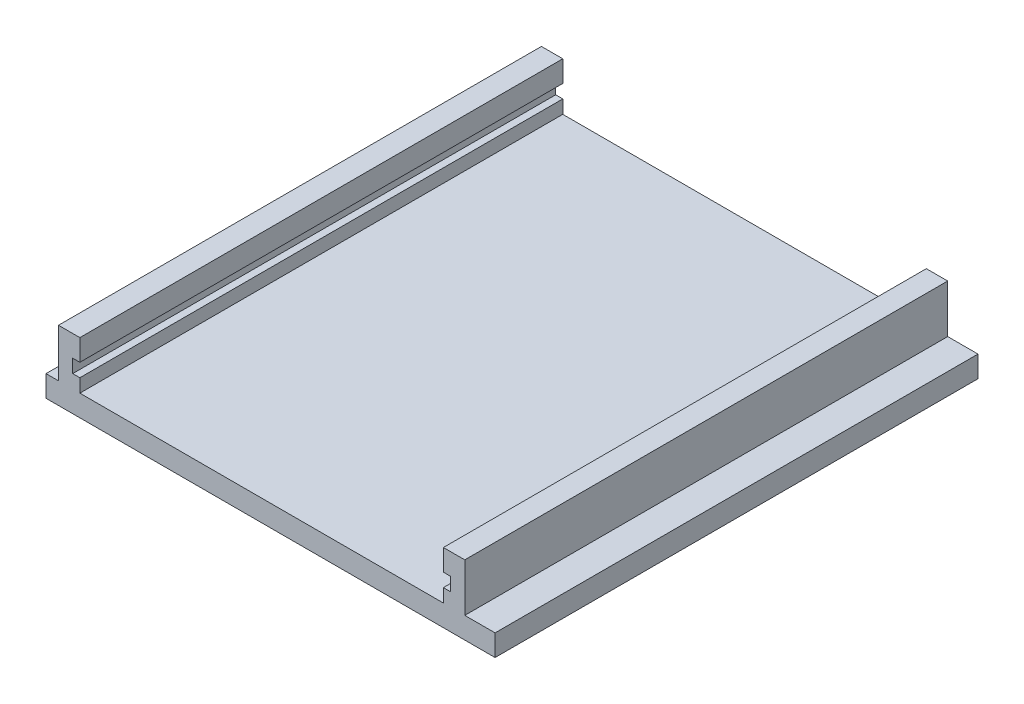
ISO-10303-21;
HEADER;
FILE_DESCRIPTION(('STEP AP214'),'2;1');
FILE_NAME('part.step','',(''),(''),'','','');
FILE_SCHEMA(('AUTOMOTIVE_DESIGN { 1 0 10303 214 1 1 1 1 }'));
ENDSEC;
DATA;
#1=APPLICATION_CONTEXT('core data for automotive mechanical design processes');
#2=APPLICATION_PROTOCOL_DEFINITION('international standard','automotive_design',2000,#1);
#3=PRODUCT_CONTEXT('',#1,'mechanical');
#4=PRODUCT('Part','Part','',(#3));
#5=PRODUCT_RELATED_PRODUCT_CATEGORY('part','',(#4));
#6=PRODUCT_DEFINITION_FORMATION('','',#4);
#7=PRODUCT_DEFINITION_CONTEXT('part definition',#1,'design');
#8=PRODUCT_DEFINITION('design','',#6,#7);
#9=PRODUCT_DEFINITION_SHAPE('','',#8);
#10=(LENGTH_UNIT() NAMED_UNIT(*) SI_UNIT(.MILLI.,.METRE.));
#11=(NAMED_UNIT(*) PLANE_ANGLE_UNIT() SI_UNIT($,.RADIAN.));
#12=(NAMED_UNIT(*) SI_UNIT($,.STERADIAN.) SOLID_ANGLE_UNIT());
#13=UNCERTAINTY_MEASURE_WITH_UNIT(LENGTH_MEASURE(1.E-05),#10,'distance_accuracy_value','');
#14=(GEOMETRIC_REPRESENTATION_CONTEXT(3) GLOBAL_UNCERTAINTY_ASSIGNED_CONTEXT((#13)) GLOBAL_UNIT_ASSIGNED_CONTEXT((#10,
#11,#12)) REPRESENTATION_CONTEXT('',''));
#15=CARTESIAN_POINT('',(0.,0.,0.));
#16=DIRECTION('',(0.,0.,1.));
#17=DIRECTION('',(1.,0.,0.));
#18=AXIS2_PLACEMENT_3D('',#15,#16,#17);
#19=CARTESIAN_POINT('',(4.826,9.906,0.));
#20=DIRECTION('',(-1.,0.,0.));
#21=DIRECTION('',(0.,0.,1.));
#22=AXIS2_PLACEMENT_3D('',#19,#20,#21);
#23=PLANE('',#22);
#24=DIRECTION('',(0.,-1.,0.));
#25=VECTOR('',#24,1.);
#26=CARTESIAN_POINT('',(4.826,9.906,-68.834));
#27=LINE('',#26,#25);
#28=CARTESIAN_POINT('',(4.826,4.953,-68.834));
#29=VERTEX_POINT('',#28);
#30=CARTESIAN_POINT('',(4.826,3.048,-68.834));
#31=VERTEX_POINT('',#30);
#32=EDGE_CURVE('E230',#29,#31,#27,.T.);
#33=ORIENTED_EDGE('',*,*,#32,.F.);
#34=DIRECTION('',(0.,0.,1.));
#35=VECTOR('',#34,1.);
#36=CARTESIAN_POINT('',(4.826,4.953,-68.834));
#37=LINE('',#36,#35);
#38=CARTESIAN_POINT('',(4.826,4.953,0.));
#39=VERTEX_POINT('',#38);
#40=EDGE_CURVE('E203',#29,#39,#37,.T.);
#41=ORIENTED_EDGE('',*,*,#40,.T.);
#42=DIRECTION('',(0.,-1.,0.));
#43=VECTOR('',#42,1.);
#44=CARTESIAN_POINT('',(4.826,9.906,0.));
#45=LINE('',#44,#43);
#46=CARTESIAN_POINT('',(4.826,3.048,0.));
#47=VERTEX_POINT('',#46);
#48=EDGE_CURVE('E58',#39,#47,#45,.T.);
#49=ORIENTED_EDGE('',*,*,#48,.T.);
#50=DIRECTION('',(0.,0.,-1.));
#51=VECTOR('',#50,1.);
#52=CARTESIAN_POINT('',(4.826,3.048,0.));
#53=LINE('',#52,#51);
#54=EDGE_CURVE('E205',#47,#31,#53,.T.);
#55=ORIENTED_EDGE('',*,*,#54,.T.);
#56=EDGE_LOOP('',(#33,#41,#49,#55));
#57=FACE_BOUND('',#56,.T.);
#58=ADVANCED_FACE('F35',(#57),#23,.F.);
#59=CARTESIAN_POINT('',(0.,3.048,0.));
#60=DIRECTION('',(0.,-1.,0.));
#61=DIRECTION('',(0.,0.,-1.));
#62=AXIS2_PLACEMENT_3D('',#59,#60,#61);
#63=PLANE('',#62);
#64=ORIENTED_EDGE('',*,*,#54,.F.);
#65=DIRECTION('',(1.,0.,0.));
#66=VECTOR('',#65,1.);
#67=CARTESIAN_POINT('',(0.,3.048,0.));
#68=LINE('',#67,#66);
#69=CARTESIAN_POINT('',(56.642,3.048,0.));
#70=VERTEX_POINT('',#69);
#71=EDGE_CURVE('E296',#47,#70,#68,.T.);
#72=ORIENTED_EDGE('',*,*,#71,.T.);
#73=DIRECTION('',(0.,0.,1.));
#74=VECTOR('',#73,1.);
#75=CARTESIAN_POINT('',(56.642,3.048,-68.834));
#76=LINE('',#75,#74);
#77=CARTESIAN_POINT('',(56.642,3.048,-68.834));
#78=VERTEX_POINT('',#77);
#79=EDGE_CURVE('E263',#78,#70,#76,.T.);
#80=ORIENTED_EDGE('',*,*,#79,.F.);
#81=DIRECTION('',(-1.,0.,0.));
#82=VECTOR('',#81,1.);
#83=CARTESIAN_POINT('',(0.,3.048,-68.834));
#84=LINE('',#83,#82);
#85=EDGE_CURVE('E302',#78,#31,#84,.T.);
#86=ORIENTED_EDGE('',*,*,#85,.T.);
#87=EDGE_LOOP('',(#64,#72,#80,#86));
#88=FACE_BOUND('',#87,.T.);
#89=ADVANCED_FACE('F340',(#88),#63,.F.);
#90=DIRECTION('',(0.,0.,1.));
#91=VECTOR('',#90,1.);
#92=CARTESIAN_POINT('',(1.778,3.048,0.));
#93=LINE('',#92,#91);
#94=CARTESIAN_POINT('',(1.778,3.048,-68.834));
#95=VERTEX_POINT('',#94);
#96=CARTESIAN_POINT('',(1.778,3.048,0.));
#97=VERTEX_POINT('',#96);
#98=EDGE_CURVE('E212',#95,#97,#93,.T.);
#99=ORIENTED_EDGE('',*,*,#98,.F.);
#100=CARTESIAN_POINT('',(0.,3.048,-68.834));
#101=VERTEX_POINT('',#100);
#102=EDGE_CURVE('E298',#95,#101,#84,.T.);
#103=ORIENTED_EDGE('',*,*,#102,.T.);
#104=DIRECTION('',(0.,0.,1.));
#105=VECTOR('',#104,1.);
#106=CARTESIAN_POINT('',(0.,3.048,0.));
#107=LINE('',#106,#105);
#108=CARTESIAN_POINT('',(0.,3.048,0.));
#109=VERTEX_POINT('',#108);
#110=EDGE_CURVE('E288',#101,#109,#107,.T.);
#111=ORIENTED_EDGE('',*,*,#110,.T.);
#112=EDGE_CURVE('E293',#109,#97,#68,.T.);
#113=ORIENTED_EDGE('',*,*,#112,.T.);
#114=EDGE_LOOP('',(#99,#103,#111,#113));
#115=FACE_BOUND('',#114,.T.);
#116=ADVANCED_FACE('F334',(#115),#63,.F.);
#117=CARTESIAN_POINT('',(56.642,9.906,-68.834));
#118=DIRECTION('',(1.,0.,0.));
#119=DIRECTION('',(0.,0.,-1.));
#120=AXIS2_PLACEMENT_3D('',#117,#118,#119);
#121=PLANE('',#120);
#122=DIRECTION('',(0.,-1.,0.));
#123=VECTOR('',#122,1.);
#124=CARTESIAN_POINT('',(56.642,9.906,-68.834));
#125=LINE('',#124,#123);
#126=CARTESIAN_POINT('',(56.642,9.906,-68.834));
#127=VERTEX_POINT('',#126);
#128=CARTESIAN_POINT('',(56.642,6.858,-68.834));
#129=VERTEX_POINT('',#128);
#130=EDGE_CURVE('E281',#127,#129,#125,.T.);
#131=ORIENTED_EDGE('',*,*,#130,.T.);
#132=DIRECTION('',(0.,0.,1.));
#133=VECTOR('',#132,1.);
#134=CARTESIAN_POINT('',(56.642,6.858,-68.834));
#135=LINE('',#134,#133);
#136=CARTESIAN_POINT('',(56.642,6.858,0.));
#137=VERTEX_POINT('',#136);
#138=EDGE_CURVE('E250',#129,#137,#135,.T.);
#139=ORIENTED_EDGE('',*,*,#138,.T.);
#140=DIRECTION('',(0.,-1.,0.));
#141=VECTOR('',#140,1.);
#142=CARTESIAN_POINT('',(56.642,9.906,0.));
#143=LINE('',#142,#141);
#144=CARTESIAN_POINT('',(56.642,9.906,0.));
#145=VERTEX_POINT('',#144);
#146=EDGE_CURVE('E277',#145,#137,#143,.T.);
#147=ORIENTED_EDGE('',*,*,#146,.F.);
#148=DIRECTION('',(0.,0.,1.));
#149=VECTOR('',#148,1.);
#150=CARTESIAN_POINT('',(56.642,9.906,-68.834));
#151=LINE('',#150,#149);
#152=EDGE_CURVE('E265',#127,#145,#151,.T.);
#153=ORIENTED_EDGE('',*,*,#152,.F.);
#154=EDGE_LOOP('',(#131,#139,#147,#153));
#155=FACE_BOUND('',#154,.T.);
#156=ADVANCED_FACE('F367',(#155),#121,.F.);
#157=DIRECTION('',(0.,0.,-1.));
#158=VECTOR('',#157,1.);
#159=CARTESIAN_POINT('',(59.69,3.048,-68.834));
#160=LINE('',#159,#158);
#161=CARTESIAN_POINT('',(59.69,3.048,0.));
#162=VERTEX_POINT('',#161);
#163=CARTESIAN_POINT('',(59.69,3.048,-68.834));
#164=VERTEX_POINT('',#163);
#165=EDGE_CURVE('E253',#162,#164,#160,.T.);
#166=ORIENTED_EDGE('',*,*,#165,.F.);
#167=CARTESIAN_POINT('',(64.008,3.048,0.));
#168=VERTEX_POINT('',#167);
#169=EDGE_CURVE('E291',#162,#168,#68,.T.);
#170=ORIENTED_EDGE('',*,*,#169,.T.);
#171=DIRECTION('',(0.,0.,-1.));
#172=VECTOR('',#171,1.);
#173=CARTESIAN_POINT('',(64.008,3.048,0.));
#174=LINE('',#173,#172);
#175=CARTESIAN_POINT('',(64.008,3.048,-68.834));
#176=VERTEX_POINT('',#175);
#177=EDGE_CURVE('E295',#168,#176,#174,.T.);
#178=ORIENTED_EDGE('',*,*,#177,.T.);
#179=EDGE_CURVE('E299',#176,#164,#84,.T.);
#180=ORIENTED_EDGE('',*,*,#179,.T.);
#181=EDGE_LOOP('',(#166,#170,#178,#180));
#182=FACE_BOUND('',#181,.T.);
#183=ADVANCED_FACE('F352',(#182),#63,.F.);
#184=CARTESIAN_POINT('',(0.,3.048,0.));
#185=DIRECTION('',(1.,0.,0.));
#186=DIRECTION('',(0.,0.,-1.));
#187=AXIS2_PLACEMENT_3D('',#184,#185,#186);
#188=PLANE('',#187);
#189=DIRECTION('',(0.,0.,1.));
#190=VECTOR('',#189,1.);
#191=CARTESIAN_POINT('',(0.,0.,0.));
#192=LINE('',#191,#190);
#193=CARTESIAN_POINT('',(0.,0.,-68.834));
#194=VERTEX_POINT('',#193);
#195=CARTESIAN_POINT('',(0.,0.,0.));
#196=VERTEX_POINT('',#195);
#197=EDGE_CURVE('E287',#194,#196,#192,.T.);
#198=ORIENTED_EDGE('',*,*,#197,.T.);
#199=DIRECTION('',(0.,-1.,0.));
#200=VECTOR('',#199,1.);
#201=CARTESIAN_POINT('',(0.,3.048,0.));
#202=LINE('',#201,#200);
#203=EDGE_CURVE('E11',#109,#196,#202,.T.);
#204=ORIENTED_EDGE('',*,*,#203,.F.);
#205=ORIENTED_EDGE('',*,*,#110,.F.);
#206=DIRECTION('',(0.,-1.,0.));
#207=VECTOR('',#206,1.);
#208=CARTESIAN_POINT('',(0.,3.048,-68.834));
#209=LINE('',#208,#207);
#210=EDGE_CURVE('E301',#101,#194,#209,.T.);
#211=ORIENTED_EDGE('',*,*,#210,.T.);
#212=EDGE_LOOP('',(#198,#204,#205,#211));
#213=FACE_BOUND('',#212,.T.);
#214=ADVANCED_FACE('F37',(#213),#188,.F.);
#215=CARTESIAN_POINT('',(0.,3.048,0.));
#216=DIRECTION('',(0.,0.,-1.));
#217=DIRECTION('',(-1.,0.,0.));
#218=AXIS2_PLACEMENT_3D('',#215,#216,#217);
#219=PLANE('',#218);
#220=ORIENTED_EDGE('',*,*,#48,.F.);
#221=DIRECTION('',(1.,0.,0.));
#222=VECTOR('',#221,1.);
#223=CARTESIAN_POINT('',(4.826,4.953,0.));
#224=LINE('',#223,#222);
#225=CARTESIAN_POINT('',(3.81,4.953,0.));
#226=VERTEX_POINT('',#225);
#227=EDGE_CURVE('E195',#226,#39,#224,.T.);
#228=ORIENTED_EDGE('',*,*,#227,.F.);
#229=DIRECTION('',(0.,-1.,0.));
#230=VECTOR('',#229,1.);
#231=CARTESIAN_POINT('',(3.81,6.858,0.));
#232=LINE('',#231,#230);
#233=CARTESIAN_POINT('',(3.81,6.858,0.));
#234=VERTEX_POINT('',#233);
#235=EDGE_CURVE('E197',#234,#226,#232,.T.);
#236=ORIENTED_EDGE('',*,*,#235,.F.);
#237=DIRECTION('',(-1.,0.,0.));
#238=VECTOR('',#237,1.);
#239=CARTESIAN_POINT('',(4.826,6.858,0.));
#240=LINE('',#239,#238);
#241=CARTESIAN_POINT('',(4.826,6.858,0.));
#242=VERTEX_POINT('',#241);
#243=EDGE_CURVE('E176',#242,#234,#240,.T.);
#244=ORIENTED_EDGE('',*,*,#243,.F.);
#245=CARTESIAN_POINT('',(4.826,9.906,0.));
#246=VERTEX_POINT('',#245);
#247=EDGE_CURVE('E221',#246,#242,#45,.T.);
#248=ORIENTED_EDGE('',*,*,#247,.F.);
#249=DIRECTION('',(1.,0.,0.));
#250=VECTOR('',#249,1.);
#251=CARTESIAN_POINT('',(4.826,9.906,0.));
#252=LINE('',#251,#250);
#253=CARTESIAN_POINT('',(1.778,9.906,0.));
#254=VERTEX_POINT('',#253);
#255=EDGE_CURVE('E216',#254,#246,#252,.T.);
#256=ORIENTED_EDGE('',*,*,#255,.F.);
#257=DIRECTION('',(0.,-1.,0.));
#258=VECTOR('',#257,1.);
#259=CARTESIAN_POINT('',(1.778,9.906,0.));
#260=LINE('',#259,#258);
#261=EDGE_CURVE('E224',#254,#97,#260,.T.);
#262=ORIENTED_EDGE('',*,*,#261,.T.);
#263=ORIENTED_EDGE('',*,*,#112,.F.);
#264=ORIENTED_EDGE('',*,*,#203,.T.);
#265=DIRECTION('',(1.,0.,0.));
#266=VECTOR('',#265,1.);
#267=CARTESIAN_POINT('',(0.,0.,0.));
#268=LINE('',#267,#266);
#269=CARTESIAN_POINT('',(64.008,0.,0.));
#270=VERTEX_POINT('',#269);
#271=EDGE_CURVE('E305',#196,#270,#268,.T.);
#272=ORIENTED_EDGE('',*,*,#271,.T.);
#273=DIRECTION('',(0.,-1.,0.));
#274=VECTOR('',#273,1.);
#275=CARTESIAN_POINT('',(64.008,3.048,0.));
#276=LINE('',#275,#274);
#277=EDGE_CURVE('E43',#168,#270,#276,.T.);
#278=ORIENTED_EDGE('',*,*,#277,.F.);
#279=ORIENTED_EDGE('',*,*,#169,.F.);
#280=DIRECTION('',(0.,-1.,0.));
#281=VECTOR('',#280,1.);
#282=CARTESIAN_POINT('',(59.69,9.906,0.));
#283=LINE('',#282,#281);
#284=CARTESIAN_POINT('',(59.69,9.906,0.));
#285=VERTEX_POINT('',#284);
#286=EDGE_CURVE('E269',#285,#162,#283,.T.);
#287=ORIENTED_EDGE('',*,*,#286,.F.);
#288=DIRECTION('',(1.,0.,0.));
#289=VECTOR('',#288,1.);
#290=CARTESIAN_POINT('',(59.69,9.906,0.));
#291=LINE('',#290,#289);
#292=EDGE_CURVE('E267',#145,#285,#291,.T.);
#293=ORIENTED_EDGE('',*,*,#292,.F.);
#294=ORIENTED_EDGE('',*,*,#146,.T.);
#295=DIRECTION('',(-1.,0.,0.));
#296=VECTOR('',#295,1.);
#297=CARTESIAN_POINT('',(56.642,6.858,0.));
#298=LINE('',#297,#296);
#299=CARTESIAN_POINT('',(57.658,6.858,0.));
#300=VERTEX_POINT('',#299);
#301=EDGE_CURVE('E237',#300,#137,#298,.T.);
#302=ORIENTED_EDGE('',*,*,#301,.F.);
#303=DIRECTION('',(0.,1.,0.));
#304=VECTOR('',#303,1.);
#305=CARTESIAN_POINT('',(57.658,6.858,0.));
#306=LINE('',#305,#304);
#307=CARTESIAN_POINT('',(57.658,4.953,0.));
#308=VERTEX_POINT('',#307);
#309=EDGE_CURVE('E246',#308,#300,#306,.T.);
#310=ORIENTED_EDGE('',*,*,#309,.F.);
#311=DIRECTION('',(1.,0.,0.));
#312=VECTOR('',#311,1.);
#313=CARTESIAN_POINT('',(56.642,4.953,0.));
#314=LINE('',#313,#312);
#315=CARTESIAN_POINT('',(56.642,4.953,0.));
#316=VERTEX_POINT('',#315);
#317=EDGE_CURVE('E232',#316,#308,#314,.T.);
#318=ORIENTED_EDGE('',*,*,#317,.F.);
#319=EDGE_CURVE('E276',#316,#70,#143,.T.);
#320=ORIENTED_EDGE('',*,*,#319,.T.);
#321=ORIENTED_EDGE('',*,*,#71,.F.);
#322=EDGE_LOOP('',(#220,#228,#236,#244,#248,#256,#262,#263,#264,#272,#278,#279,#287,#293,#294,
#302,#310,#318,#320,#321));
#323=FACE_BOUND('',#322,.T.);
#324=ADVANCED_FACE('F347',(#323),#219,.F.);
#325=CARTESIAN_POINT('',(64.008,3.048,0.));
#326=DIRECTION('',(-1.,0.,0.));
#327=DIRECTION('',(0.,0.,1.));
#328=AXIS2_PLACEMENT_3D('',#325,#326,#327);
#329=PLANE('',#328);
#330=DIRECTION('',(0.,0.,-1.));
#331=VECTOR('',#330,1.);
#332=CARTESIAN_POINT('',(64.008,0.,0.));
#333=LINE('',#332,#331);
#334=CARTESIAN_POINT('',(64.008,0.,-68.834));
#335=VERTEX_POINT('',#334);
#336=EDGE_CURVE('E307',#270,#335,#333,.T.);
#337=ORIENTED_EDGE('',*,*,#336,.T.);
#338=DIRECTION('',(0.,-1.,0.));
#339=VECTOR('',#338,1.);
#340=CARTESIAN_POINT('',(64.008,3.048,-68.834));
#341=LINE('',#340,#339);
#342=EDGE_CURVE('E312',#176,#335,#341,.T.);
#343=ORIENTED_EDGE('',*,*,#342,.F.);
#344=ORIENTED_EDGE('',*,*,#177,.F.);
#345=ORIENTED_EDGE('',*,*,#277,.T.);
#346=EDGE_LOOP('',(#337,#343,#344,#345));
#347=FACE_BOUND('',#346,.T.);
#348=ADVANCED_FACE('F319',(#347),#329,.F.);
#349=CARTESIAN_POINT('',(0.,3.048,-68.834));
#350=DIRECTION('',(0.,0.,1.));
#351=DIRECTION('',(1.,0.,0.));
#352=AXIS2_PLACEMENT_3D('',#349,#350,#351);
#353=PLANE('',#352);
#354=DIRECTION('',(0.,-1.,0.));
#355=VECTOR('',#354,1.);
#356=CARTESIAN_POINT('',(3.81,6.858,-68.834));
#357=LINE('',#356,#355);
#358=CARTESIAN_POINT('',(3.81,6.858,-68.834));
#359=VERTEX_POINT('',#358);
#360=CARTESIAN_POINT('',(3.81,4.953,-68.834));
#361=VERTEX_POINT('',#360);
#362=EDGE_CURVE('E184',#359,#361,#357,.T.);
#363=ORIENTED_EDGE('',*,*,#362,.T.);
#364=DIRECTION('',(1.,0.,0.));
#365=VECTOR('',#364,1.);
#366=CARTESIAN_POINT('',(4.826,4.953,-68.834));
#367=LINE('',#366,#365);
#368=EDGE_CURVE('E189',#361,#29,#367,.T.);
#369=ORIENTED_EDGE('',*,*,#368,.T.);
#370=ORIENTED_EDGE('',*,*,#32,.T.);
#371=ORIENTED_EDGE('',*,*,#85,.F.);
#372=CARTESIAN_POINT('',(56.642,4.953,-68.834));
#373=VERTEX_POINT('',#372);
#374=EDGE_CURVE('E280',#373,#78,#125,.T.);
#375=ORIENTED_EDGE('',*,*,#374,.F.);
#376=DIRECTION('',(1.,0.,0.));
#377=VECTOR('',#376,1.);
#378=CARTESIAN_POINT('',(56.642,4.953,-68.834));
#379=LINE('',#378,#377);
#380=CARTESIAN_POINT('',(57.658,4.953,-68.834));
#381=VERTEX_POINT('',#380);
#382=EDGE_CURVE('E233',#373,#381,#379,.T.);
#383=ORIENTED_EDGE('',*,*,#382,.T.);
#384=DIRECTION('',(0.,1.,0.));
#385=VECTOR('',#384,1.);
#386=CARTESIAN_POINT('',(57.658,6.858,-68.834));
#387=LINE('',#386,#385);
#388=CARTESIAN_POINT('',(57.658,6.858,-68.834));
#389=VERTEX_POINT('',#388);
#390=EDGE_CURVE('E236',#381,#389,#387,.T.);
#391=ORIENTED_EDGE('',*,*,#390,.T.);
#392=DIRECTION('',(-1.,0.,0.));
#393=VECTOR('',#392,1.);
#394=CARTESIAN_POINT('',(56.642,6.858,-68.834));
#395=LINE('',#394,#393);
#396=EDGE_CURVE('E240',#389,#129,#395,.T.);
#397=ORIENTED_EDGE('',*,*,#396,.T.);
#398=ORIENTED_EDGE('',*,*,#130,.F.);
#399=DIRECTION('',(-1.,0.,0.));
#400=VECTOR('',#399,1.);
#401=CARTESIAN_POINT('',(59.69,9.906,-68.834));
#402=LINE('',#401,#400);
#403=CARTESIAN_POINT('',(59.69,9.906,-68.834));
#404=VERTEX_POINT('',#403);
#405=EDGE_CURVE('E262',#404,#127,#402,.T.);
#406=ORIENTED_EDGE('',*,*,#405,.F.);
#407=DIRECTION('',(0.,-1.,0.));
#408=VECTOR('',#407,1.);
#409=CARTESIAN_POINT('',(59.69,9.906,-68.834));
#410=LINE('',#409,#408);
#411=EDGE_CURVE('E284',#404,#164,#410,.T.);
#412=ORIENTED_EDGE('',*,*,#411,.T.);
#413=ORIENTED_EDGE('',*,*,#179,.F.);
#414=ORIENTED_EDGE('',*,*,#342,.T.);
#415=DIRECTION('',(-1.,0.,0.));
#416=VECTOR('',#415,1.);
#417=CARTESIAN_POINT('',(0.,0.,-68.834));
#418=LINE('',#417,#416);
#419=EDGE_CURVE('E292',#335,#194,#418,.T.);
#420=ORIENTED_EDGE('',*,*,#419,.T.);
#421=ORIENTED_EDGE('',*,*,#210,.F.);
#422=ORIENTED_EDGE('',*,*,#102,.F.);
#423=DIRECTION('',(0.,-1.,0.));
#424=VECTOR('',#423,1.);
#425=CARTESIAN_POINT('',(1.778,9.906,-68.834));
#426=LINE('',#425,#424);
#427=CARTESIAN_POINT('',(1.778,9.906,-68.834));
#428=VERTEX_POINT('',#427);
#429=EDGE_CURVE('E227',#428,#95,#426,.T.);
#430=ORIENTED_EDGE('',*,*,#429,.F.);
#431=DIRECTION('',(-1.,0.,0.));
#432=VECTOR('',#431,1.);
#433=CARTESIAN_POINT('',(4.826,9.906,-68.834));
#434=LINE('',#433,#432);
#435=CARTESIAN_POINT('',(4.826,9.906,-68.834));
#436=VERTEX_POINT('',#435);
#437=EDGE_CURVE('E211',#436,#428,#434,.T.);
#438=ORIENTED_EDGE('',*,*,#437,.F.);
#439=CARTESIAN_POINT('',(4.826,6.858,-68.834));
#440=VERTEX_POINT('',#439);
#441=EDGE_CURVE('E194',#436,#440,#27,.T.);
#442=ORIENTED_EDGE('',*,*,#441,.T.);
#443=DIRECTION('',(-1.,0.,0.));
#444=VECTOR('',#443,1.);
#445=CARTESIAN_POINT('',(4.826,6.858,-68.834));
#446=LINE('',#445,#444);
#447=EDGE_CURVE('E50',#440,#359,#446,.T.);
#448=ORIENTED_EDGE('',*,*,#447,.T.);
#449=EDGE_LOOP('',(#363,#369,#370,#371,#375,#383,#391,#397,#398,#406,#412,#413,#414,#420,#421,
#422,#430,#438,#442,#448));
#450=FACE_BOUND('',#449,.T.);
#451=ADVANCED_FACE('F192',(#450),#353,.F.);
#452=CARTESIAN_POINT('',(0.,0.,0.));
#453=DIRECTION('',(0.,-1.,0.));
#454=DIRECTION('',(0.,0.,-1.));
#455=AXIS2_PLACEMENT_3D('',#452,#453,#454);
#456=PLANE('',#455);
#457=ORIENTED_EDGE('',*,*,#197,.F.);
#458=ORIENTED_EDGE('',*,*,#419,.F.);
#459=ORIENTED_EDGE('',*,*,#336,.F.);
#460=ORIENTED_EDGE('',*,*,#271,.F.);
#461=EDGE_LOOP('',(#457,#458,#459,#460));
#462=FACE_BOUND('',#461,.T.);
#463=ADVANCED_FACE('F326',(#462),#456,.T.);
#464=CARTESIAN_POINT('',(59.69,9.906,-68.834));
#465=DIRECTION('',(-1.,0.,0.));
#466=DIRECTION('',(0.,0.,1.));
#467=AXIS2_PLACEMENT_3D('',#464,#465,#466);
#468=PLANE('',#467);
#469=ORIENTED_EDGE('',*,*,#165,.T.);
#470=ORIENTED_EDGE('',*,*,#411,.F.);
#471=DIRECTION('',(0.,0.,-1.));
#472=VECTOR('',#471,1.);
#473=CARTESIAN_POINT('',(59.69,9.906,-68.834));
#474=LINE('',#473,#472);
#475=EDGE_CURVE('E259',#285,#404,#474,.T.);
#476=ORIENTED_EDGE('',*,*,#475,.F.);
#477=ORIENTED_EDGE('',*,*,#286,.T.);
#478=EDGE_LOOP('',(#469,#470,#476,#477));
#479=FACE_BOUND('',#478,.T.);
#480=ADVANCED_FACE('F357',(#479),#468,.F.);
#481=ORIENTED_EDGE('',*,*,#319,.F.);
#482=DIRECTION('',(0.,0.,1.));
#483=VECTOR('',#482,1.);
#484=CARTESIAN_POINT('',(56.642,4.953,-68.834));
#485=LINE('',#484,#483);
#486=EDGE_CURVE('E243',#373,#316,#485,.T.);
#487=ORIENTED_EDGE('',*,*,#486,.F.);
#488=ORIENTED_EDGE('',*,*,#374,.T.);
#489=ORIENTED_EDGE('',*,*,#79,.T.);
#490=EDGE_LOOP('',(#481,#487,#488,#489));
#491=FACE_BOUND('',#490,.T.);
#492=ADVANCED_FACE('F377',(#491),#121,.F.);
#493=CARTESIAN_POINT('',(0.,9.906,0.));
#494=DIRECTION('',(0.,-1.,0.));
#495=DIRECTION('',(0.,0.,-1.));
#496=AXIS2_PLACEMENT_3D('',#493,#494,#495);
#497=PLANE('',#496);
#498=ORIENTED_EDGE('',*,*,#475,.T.);
#499=ORIENTED_EDGE('',*,*,#405,.T.);
#500=ORIENTED_EDGE('',*,*,#152,.T.);
#501=ORIENTED_EDGE('',*,*,#292,.T.);
#502=EDGE_LOOP('',(#498,#499,#500,#501));
#503=FACE_BOUND('',#502,.T.);
#504=ADVANCED_FACE('F360',(#503),#497,.F.);
#505=CARTESIAN_POINT('',(56.642,6.858,-68.834));
#506=DIRECTION('',(0.,1.,0.));
#507=DIRECTION('',(0.,0.,1.));
#508=AXIS2_PLACEMENT_3D('',#505,#506,#507);
#509=PLANE('',#508);
#510=ORIENTED_EDGE('',*,*,#301,.T.);
#511=ORIENTED_EDGE('',*,*,#138,.F.);
#512=ORIENTED_EDGE('',*,*,#396,.F.);
#513=DIRECTION('',(0.,0.,1.));
#514=VECTOR('',#513,1.);
#515=CARTESIAN_POINT('',(57.658,6.858,-68.834));
#516=LINE('',#515,#514);
#517=EDGE_CURVE('E254',#389,#300,#516,.T.);
#518=ORIENTED_EDGE('',*,*,#517,.T.);
#519=EDGE_LOOP('',(#510,#511,#512,#518));
#520=FACE_BOUND('',#519,.T.);
#521=ADVANCED_FACE('F370',(#520),#509,.F.);
#522=CARTESIAN_POINT('',(57.658,6.858,-68.834));
#523=DIRECTION('',(1.,0.,0.));
#524=DIRECTION('',(0.,0.,-1.));
#525=AXIS2_PLACEMENT_3D('',#522,#523,#524);
#526=PLANE('',#525);
#527=ORIENTED_EDGE('',*,*,#309,.T.);
#528=ORIENTED_EDGE('',*,*,#517,.F.);
#529=ORIENTED_EDGE('',*,*,#390,.F.);
#530=DIRECTION('',(0.,0.,1.));
#531=VECTOR('',#530,1.);
#532=CARTESIAN_POINT('',(57.658,4.953,-68.834));
#533=LINE('',#532,#531);
#534=EDGE_CURVE('E256',#381,#308,#533,.T.);
#535=ORIENTED_EDGE('',*,*,#534,.T.);
#536=EDGE_LOOP('',(#527,#528,#529,#535));
#537=FACE_BOUND('',#536,.T.);
#538=ADVANCED_FACE('F373',(#537),#526,.F.);
#539=CARTESIAN_POINT('',(56.642,4.953,-68.834));
#540=DIRECTION('',(0.,-1.,0.));
#541=DIRECTION('',(0.,0.,-1.));
#542=AXIS2_PLACEMENT_3D('',#539,#540,#541);
#543=PLANE('',#542);
#544=ORIENTED_EDGE('',*,*,#317,.T.);
#545=ORIENTED_EDGE('',*,*,#534,.F.);
#546=ORIENTED_EDGE('',*,*,#382,.F.);
#547=ORIENTED_EDGE('',*,*,#486,.T.);
#548=EDGE_LOOP('',(#544,#545,#546,#547));
#549=FACE_BOUND('',#548,.T.);
#550=ADVANCED_FACE('F378',(#549),#543,.F.);
#551=ORIENTED_EDGE('',*,*,#247,.T.);
#552=DIRECTION('',(0.,0.,1.));
#553=VECTOR('',#552,1.);
#554=CARTESIAN_POINT('',(4.826,6.858,-68.834));
#555=LINE('',#554,#553);
#556=EDGE_CURVE('E181',#440,#242,#555,.T.);
#557=ORIENTED_EDGE('',*,*,#556,.F.);
#558=ORIENTED_EDGE('',*,*,#441,.F.);
#559=DIRECTION('',(0.,0.,-1.));
#560=VECTOR('',#559,1.);
#561=CARTESIAN_POINT('',(4.826,9.906,0.));
#562=LINE('',#561,#560);
#563=EDGE_CURVE('E208',#246,#436,#562,.T.);
#564=ORIENTED_EDGE('',*,*,#563,.F.);
#565=EDGE_LOOP('',(#551,#557,#558,#564));
#566=FACE_BOUND('',#565,.T.);
#567=ADVANCED_FACE('F380',(#566),#23,.F.);
#568=CARTESIAN_POINT('',(1.778,9.906,0.));
#569=DIRECTION('',(1.,0.,0.));
#570=DIRECTION('',(0.,0.,-1.));
#571=AXIS2_PLACEMENT_3D('',#568,#569,#570);
#572=PLANE('',#571);
#573=ORIENTED_EDGE('',*,*,#98,.T.);
#574=ORIENTED_EDGE('',*,*,#261,.F.);
#575=DIRECTION('',(0.,0.,1.));
#576=VECTOR('',#575,1.);
#577=CARTESIAN_POINT('',(1.778,9.906,0.));
#578=LINE('',#577,#576);
#579=EDGE_CURVE('E214',#428,#254,#578,.T.);
#580=ORIENTED_EDGE('',*,*,#579,.F.);
#581=ORIENTED_EDGE('',*,*,#429,.T.);
#582=EDGE_LOOP('',(#573,#574,#580,#581));
#583=FACE_BOUND('',#582,.T.);
#584=ADVANCED_FACE('F386',(#583),#572,.F.);
#585=CARTESIAN_POINT('',(0.,9.906,0.));
#586=DIRECTION('',(0.,1.,0.));
#587=DIRECTION('',(0.,0.,1.));
#588=AXIS2_PLACEMENT_3D('',#585,#586,#587);
#589=PLANE('',#588);
#590=ORIENTED_EDGE('',*,*,#563,.T.);
#591=ORIENTED_EDGE('',*,*,#437,.T.);
#592=ORIENTED_EDGE('',*,*,#579,.T.);
#593=ORIENTED_EDGE('',*,*,#255,.T.);
#594=EDGE_LOOP('',(#590,#591,#592,#593));
#595=FACE_BOUND('',#594,.T.);
#596=ADVANCED_FACE('F512',(#595),#589,.T.);
#597=CARTESIAN_POINT('',(4.826,4.953,-68.834));
#598=DIRECTION('',(0.,-1.,0.));
#599=DIRECTION('',(0.,0.,-1.));
#600=AXIS2_PLACEMENT_3D('',#597,#598,#599);
#601=PLANE('',#600);
#602=ORIENTED_EDGE('',*,*,#227,.T.);
#603=ORIENTED_EDGE('',*,*,#40,.F.);
#604=ORIENTED_EDGE('',*,*,#368,.F.);
#605=DIRECTION('',(0.,0.,1.));
#606=VECTOR('',#605,1.);
#607=CARTESIAN_POINT('',(3.81,4.953,-68.834));
#608=LINE('',#607,#606);
#609=EDGE_CURVE('E180',#361,#226,#608,.T.);
#610=ORIENTED_EDGE('',*,*,#609,.T.);
#611=EDGE_LOOP('',(#602,#603,#604,#610));
#612=FACE_BOUND('',#611,.T.);
#613=ADVANCED_FACE('F345',(#612),#601,.F.);
#614=CARTESIAN_POINT('',(3.81,6.858,-68.834));
#615=DIRECTION('',(-1.,0.,0.));
#616=DIRECTION('',(0.,-1.,0.));
#617=AXIS2_PLACEMENT_3D('',#614,#615,#616);
#618=PLANE('',#617);
#619=ORIENTED_EDGE('',*,*,#235,.T.);
#620=ORIENTED_EDGE('',*,*,#609,.F.);
#621=ORIENTED_EDGE('',*,*,#362,.F.);
#622=DIRECTION('',(0.,0.,1.));
#623=VECTOR('',#622,1.);
#624=CARTESIAN_POINT('',(3.81,6.858,-68.834));
#625=LINE('',#624,#623);
#626=EDGE_CURVE('E172',#359,#234,#625,.T.);
#627=ORIENTED_EDGE('',*,*,#626,.T.);
#628=EDGE_LOOP('',(#619,#620,#621,#627));
#629=FACE_BOUND('',#628,.T.);
#630=ADVANCED_FACE('F185',(#629),#618,.F.);
#631=CARTESIAN_POINT('',(4.826,6.858,-68.834));
#632=DIRECTION('',(0.,1.,0.));
#633=DIRECTION('',(0.,0.,1.));
#634=AXIS2_PLACEMENT_3D('',#631,#632,#633);
#635=PLANE('',#634);
#636=ORIENTED_EDGE('',*,*,#243,.T.);
#637=ORIENTED_EDGE('',*,*,#626,.F.);
#638=ORIENTED_EDGE('',*,*,#447,.F.);
#639=ORIENTED_EDGE('',*,*,#556,.T.);
#640=EDGE_LOOP('',(#636,#637,#638,#639));
#641=FACE_BOUND('',#640,.T.);
#642=ADVANCED_FACE('F174',(#641),#635,.F.);
#643=CLOSED_SHELL('',(#58,#89,#116,#156,#183,#214,#324,#348,#451,#463,#480,#492,#504,#521,#538,
#550,#567,#584,#596,#613,#630,#642));
#644=MANIFOLD_SOLID_BREP('B2',#643);
#645=ADVANCED_BREP_SHAPE_REPRESENTATION('',(#18,#644),#14);
#646=SHAPE_DEFINITION_REPRESENTATION(#9,#645);
ENDSEC;
END-ISO-10303-21;
